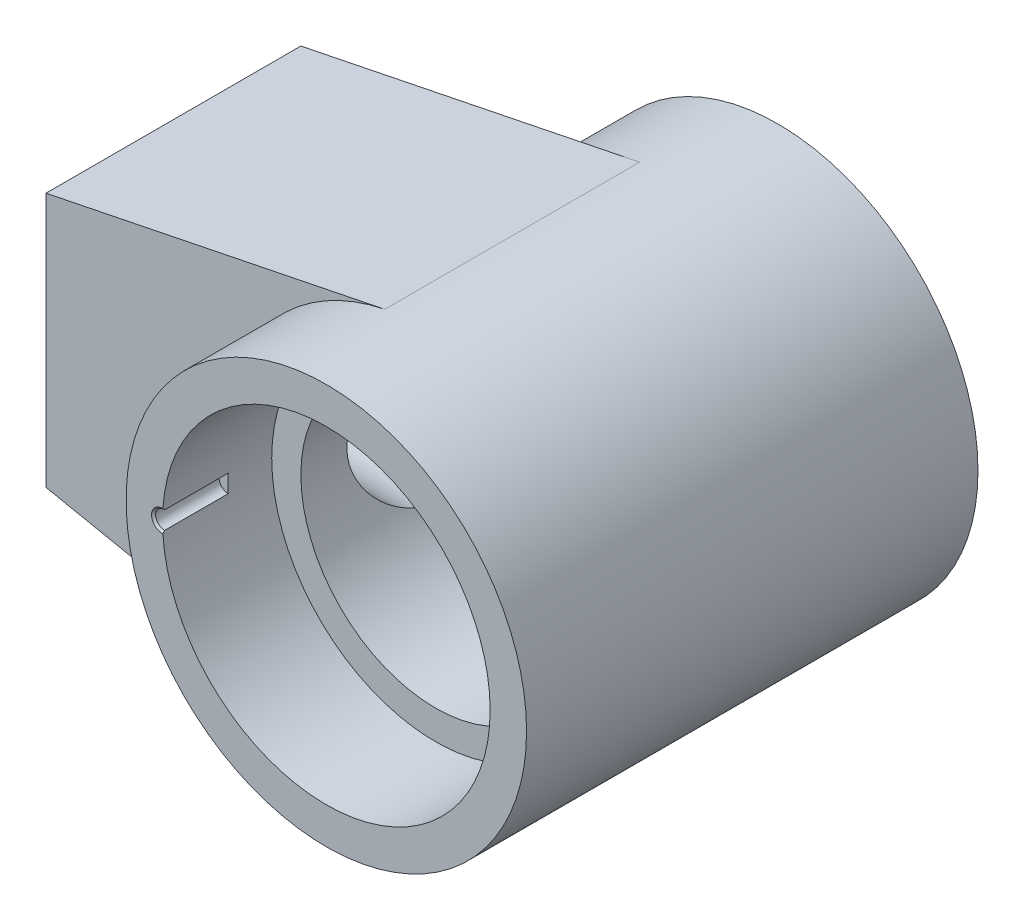
ISO-10303-21;
HEADER;
FILE_DESCRIPTION(('STEP AP214'),'2;1');
FILE_NAME('part.step','',(''),(''),'','','');
FILE_SCHEMA(('AUTOMOTIVE_DESIGN { 1 0 10303 214 1 1 1 1 }'));
ENDSEC;
DATA;
#1=APPLICATION_CONTEXT('core data for automotive mechanical design processes');
#2=APPLICATION_PROTOCOL_DEFINITION('international standard','automotive_design',2000,#1);
#3=PRODUCT_CONTEXT('',#1,'mechanical');
#4=PRODUCT('Part','Part','',(#3));
#5=PRODUCT_RELATED_PRODUCT_CATEGORY('part','',(#4));
#6=PRODUCT_DEFINITION_FORMATION('','',#4);
#7=PRODUCT_DEFINITION_CONTEXT('part definition',#1,'design');
#8=PRODUCT_DEFINITION('design','',#6,#7);
#9=PRODUCT_DEFINITION_SHAPE('','',#8);
#10=(LENGTH_UNIT() NAMED_UNIT(*) SI_UNIT(.MILLI.,.METRE.));
#11=(NAMED_UNIT(*) PLANE_ANGLE_UNIT() SI_UNIT($,.RADIAN.));
#12=(NAMED_UNIT(*) SI_UNIT($,.STERADIAN.) SOLID_ANGLE_UNIT());
#13=UNCERTAINTY_MEASURE_WITH_UNIT(LENGTH_MEASURE(1.E-05),#10,'distance_accuracy_value','');
#14=(GEOMETRIC_REPRESENTATION_CONTEXT(3) GLOBAL_UNCERTAINTY_ASSIGNED_CONTEXT((#13)) GLOBAL_UNIT_ASSIGNED_CONTEXT((#10,
#11,#12)) REPRESENTATION_CONTEXT('',''));
#15=CARTESIAN_POINT('',(0.,0.,0.));
#16=DIRECTION('',(0.,0.,1.));
#17=DIRECTION('',(1.,0.,0.));
#18=AXIS2_PLACEMENT_3D('',#15,#16,#17);
#19=CARTESIAN_POINT('',(0.,0.,62.));
#20=DIRECTION('',(0.,0.,1.));
#21=DIRECTION('',(1.,0.,0.));
#22=AXIS2_PLACEMENT_3D('',#19,#20,#21);
#23=PLANE('',#22);
#24=CARTESIAN_POINT('',(0.,0.,62.));
#25=DIRECTION('',(0.,0.,1.));
#26=DIRECTION('',(1.,0.,0.));
#27=AXIS2_PLACEMENT_3D('',#24,#25,#26);
#28=CIRCLE('',#27,55.);
#29=CARTESIAN_POINT('',(55.,0.,62.));
#30=VERTEX_POINT('',#29);
#31=EDGE_CURVE('E304',#30,#30,#28,.T.);
#32=ORIENTED_EDGE('',*,*,#31,.T.);
#33=EDGE_LOOP('',(#32));
#34=FACE_BOUND('',#33,.T.);
#35=CARTESIAN_POINT('',(0.,0.,62.));
#36=DIRECTION('',(0.,0.,1.));
#37=DIRECTION('',(1.,0.,0.));
#38=AXIS2_PLACEMENT_3D('',#35,#36,#37);
#39=CIRCLE('',#38,45.);
#40=CARTESIAN_POINT('',(-44.9,-2.99833287011296,62.));
#41=VERTEX_POINT('',#40);
#42=CARTESIAN_POINT('',(-44.9,2.99833287011296,62.));
#43=VERTEX_POINT('',#42);
#44=EDGE_CURVE('E275',#41,#43,#39,.T.);
#45=ORIENTED_EDGE('',*,*,#44,.F.);
#46=CARTESIAN_POINT('',(-45.,0.,62.));
#47=DIRECTION('',(0.,0.,1.));
#48=DIRECTION('',(1.,0.,0.));
#49=AXIS2_PLACEMENT_3D('',#46,#47,#48);
#50=CIRCLE('',#49,2.99999999999998);
#51=EDGE_CURVE('E132',#41,#43,#50,.F.);
#52=ORIENTED_EDGE('',*,*,#51,.T.);
#53=EDGE_LOOP('',(#45,#52));
#54=FACE_BOUND('',#53,.T.);
#55=ADVANCED_FACE('F36',(#34,#54),#23,.T.);
#56=CARTESIAN_POINT('',(0.,0.,32.));
#57=DIRECTION('',(0.,0.,1.));
#58=DIRECTION('',(1.,0.,0.));
#59=AXIS2_PLACEMENT_3D('',#56,#57,#58);
#60=CYLINDRICAL_SURFACE('',#59,45.);
#61=CARTESIAN_POINT('',(0.,0.,32.));
#62=DIRECTION('',(0.,0.,1.));
#63=DIRECTION('',(1.,0.,0.));
#64=AXIS2_PLACEMENT_3D('',#61,#62,#63);
#65=CIRCLE('',#64,45.);
#66=CARTESIAN_POINT('',(45.,0.,32.));
#67=VERTEX_POINT('',#66);
#68=EDGE_CURVE('E271',#67,#67,#65,.T.);
#69=ORIENTED_EDGE('',*,*,#68,.F.);
#70=EDGE_LOOP('',(#69));
#71=FACE_BOUND('',#70,.T.);
#72=ORIENTED_EDGE('',*,*,#44,.T.);
#73=CARTESIAN_POINT('',(-44.9,2.99833287011296,62.));
#74=CARTESIAN_POINT('',(-44.9061608501905,2.90607372986825,61.9075876456696));
#75=CARTESIAN_POINT('',(-44.9120371361656,2.81379950729287,61.8151731351687));
#76=CARTESIAN_POINT('',(-44.923220579684,2.62922089749069,61.6303398018353));
#77=CARTESIAN_POINT('',(-44.9285277372275,2.5369165102639,61.537920979003));
#78=CARTESIAN_POINT('',(-44.9335503305556,2.44459704070645,61.4455));
#79=B_SPLINE_CURVE_WITH_KNOTS('',3,(#73,#74,#75,#76,#77,#78),.UNSPECIFIED.,.F.,.F.,(4,2,4),(0.,
0.39218049640312,0.784360992764142),.UNSPECIFIED.);
#80=CARTESIAN_POINT('',(-44.9335503305555,2.44459704070645,61.4455));
#81=VERTEX_POINT('',#80);
#82=EDGE_CURVE('E130',#43,#81,#79,.T.);
#83=ORIENTED_EDGE('',*,*,#82,.T.);
#84=DIRECTION('',(0.,0.,1.));
#85=VECTOR('',#84,1.);
#86=CARTESIAN_POINT('',(-44.9335503305555,2.44459704070645,53.));
#87=LINE('',#86,#85);
#88=CARTESIAN_POINT('',(-44.9335503305556,2.44459704070645,44.));
#89=VERTEX_POINT('',#88);
#90=EDGE_CURVE('E118',#89,#81,#87,.T.);
#91=ORIENTED_EDGE('',*,*,#90,.F.);
#92=CARTESIAN_POINT('',(0.,0.,44.));
#93=DIRECTION('',(0.,0.,1.));
#94=DIRECTION('',(1.,0.,0.));
#95=AXIS2_PLACEMENT_3D('',#92,#93,#94);
#96=CIRCLE('',#95,45.);
#97=CARTESIAN_POINT('',(-44.9335503305556,-2.44459704070645,44.));
#98=VERTEX_POINT('',#97);
#99=EDGE_CURVE('E111',#98,#89,#96,.F.);
#100=ORIENTED_EDGE('',*,*,#99,.F.);
#101=DIRECTION('',(0.,0.,1.));
#102=VECTOR('',#101,1.);
#103=CARTESIAN_POINT('',(-44.9335503305555,-2.44459704070645,53.));
#104=LINE('',#103,#102);
#105=CARTESIAN_POINT('',(-44.9335503305555,-2.44459704070645,61.4455));
#106=VERTEX_POINT('',#105);
#107=EDGE_CURVE('E125',#106,#98,#104,.F.);
#108=ORIENTED_EDGE('',*,*,#107,.F.);
#109=CARTESIAN_POINT('',(-44.9335503305555,-2.44459704070645,61.4455));
#110=CARTESIAN_POINT('',(-44.9285277372275,-2.5369165102639,61.537920979003));
#111=CARTESIAN_POINT('',(-44.923220579684,-2.62922089749069,61.6303398018353));
#112=CARTESIAN_POINT('',(-44.9120371361656,-2.81379950729287,61.8151731351687));
#113=CARTESIAN_POINT('',(-44.9061608501905,-2.90607372986825,61.9075876456696));
#114=CARTESIAN_POINT('',(-44.9,-2.99833287011297,62.));
#115=B_SPLINE_CURVE_WITH_KNOTS('',3,(#109,#110,#111,#112,#113,#114),.UNSPECIFIED.,.F.,.F.,(4,2,
4),(0.,0.392180496361022,0.784360992764143),.UNSPECIFIED.);
#116=EDGE_CURVE('E138',#106,#41,#115,.T.);
#117=ORIENTED_EDGE('',*,*,#116,.T.);
#118=EDGE_LOOP('',(#72,#83,#91,#100,#108,#117));
#119=FACE_BOUND('',#118,.T.);
#120=ADVANCED_FACE('F129',(#71,#119),#60,.F.);
#121=CARTESIAN_POINT('',(0.,0.,-62.));
#122=DIRECTION('',(0.,0.,1.));
#123=DIRECTION('',(1.,0.,0.));
#124=AXIS2_PLACEMENT_3D('',#121,#122,#123);
#125=CYLINDRICAL_SURFACE('',#124,37.);
#126=CARTESIAN_POINT('',(-37.,0.,19.352));
#127=CARTESIAN_POINT('',(-37.0000005981691,-0.506052389142178,19.3520007767979));
#128=CARTESIAN_POINT('',(-36.9895954964608,-1.01209703583665,19.3321292544199));
#129=CARTESIAN_POINT('',(-36.9482420706369,-2.02042269786199,19.2528864913063));
#130=CARTESIAN_POINT('',(-36.9172860887485,-2.52270223963875,19.1935005264803));
#131=CARTESIAN_POINT('',(-36.8355649389102,-3.52022469257321,19.0358422705501));
#132=CARTESIAN_POINT('',(-36.7847708466761,-4.01545622989124,18.9375131968104));
#133=CARTESIAN_POINT('',(-36.6646659427644,-4.9945512790452,18.7031480711273));
#134=CARTESIAN_POINT('',(-36.5953566725505,-5.47841573359016,18.5671151581462));
#135=CARTESIAN_POINT('',(-36.440224593301,-6.42972739055406,18.2594479074291));
#136=CARTESIAN_POINT('',(-36.3544695553745,-6.8972329664037,18.0879594588808));
#137=CARTESIAN_POINT('',(-36.1682555541144,-7.81515442298426,17.7107175181484));
#138=CARTESIAN_POINT('',(-36.0677963363498,-8.26557000783181,17.5049634330466));
#139=CARTESIAN_POINT('',(-35.8544229269288,-9.14690759609061,17.0609914892987));
#140=CARTESIAN_POINT('',(-35.7415107218637,-9.57783269334452,16.8227788072608));
#141=CARTESIAN_POINT('',(-35.5056204451637,-10.4183244494518,16.3156175861637));
#142=CARTESIAN_POINT('',(-35.3826415025798,-10.8278892552367,16.0466663868853));
#143=CARTESIAN_POINT('',(-35.1210067498783,-11.6495728856682,15.461496055963));
#144=CARTESIAN_POINT('',(-34.9818513800329,-12.0601599431576,15.1433489030841));
#145=CARTESIAN_POINT('',(-34.6982309384198,-12.853413226828,14.4761292811505));
#146=CARTESIAN_POINT('',(-34.5537656774987,-13.2360784569017,14.1270557097829));
#147=CARTESIAN_POINT('',(-34.2627491701499,-13.9721424390472,13.3995193011221));
#148=CARTESIAN_POINT('',(-34.1161963924723,-14.325518257621,13.0210338754211));
#149=CARTESIAN_POINT('',(-33.8245859300124,-15.0010924809659,12.2366286963572));
#150=CARTESIAN_POINT('',(-33.679528319043,-15.3232893530283,11.8307075959632));
#151=CARTESIAN_POINT('',(-33.3821014874946,-15.9615099909244,10.9566349452515));
#152=CARTESIAN_POINT('',(-33.2301954305391,-16.2745533634966,10.4861423888152));
#153=CARTESIAN_POINT('',(-32.9372410994983,-16.8595731989986,9.51708917371545));
#154=CARTESIAN_POINT('',(-32.7961920865564,-17.131552457686,9.01853042905083));
#155=CARTESIAN_POINT('',(-32.5299271173334,-17.6319075215883,7.99621219001476));
#156=CARTESIAN_POINT('',(-32.4047032093171,-17.8603052551288,7.47246553608207));
#157=CARTESIAN_POINT('',(-32.1748937237233,-18.2710614497447,6.40283467926718));
#158=CARTESIAN_POINT('',(-32.070305650227,-18.4534254793753,5.85695316325201));
#159=CARTESIAN_POINT('',(-31.8919827061672,-18.7598220436959,4.7814252518492));
#160=CARTESIAN_POINT('',(-31.8167412212346,-18.8867616418427,4.25285847438943));
#161=CARTESIAN_POINT('',(-31.6915810918886,-19.0960370571894,3.18398352995439));
#162=CARTESIAN_POINT('',(-31.6416612640038,-19.1783749589742,2.64367591294793));
#163=CARTESIAN_POINT('',(-31.5694436736182,-19.2970225373591,1.55672928224647));
#164=CARTESIAN_POINT('',(-31.5471182663029,-19.3333782809433,1.01009715983012));
#165=CARTESIAN_POINT('',(-31.5310617463493,-19.3595565594709,-0.0846732269199204));
#166=CARTESIAN_POINT('',(-31.5373274167103,-19.3493843296321,-0.632811314870108));
#167=CARTESIAN_POINT('',(-31.5753870002611,-19.2871961525082,-1.65183489643683));
#168=CARTESIAN_POINT('',(-31.6036443295844,-19.2409753102658,-2.12322143275913));
#169=CARTESIAN_POINT('',(-31.6803413348338,-19.1144305464454,-3.05967906561738));
#170=CARTESIAN_POINT('',(-31.728778874972,-19.0341102337937,-3.52475082510554));
#171=CARTESIAN_POINT('',(-31.8442374179493,-18.8403085656461,-4.44569562723011));
#172=CARTESIAN_POINT('',(-31.9112640219202,-18.7268172147198,-4.9015658528383));
#173=CARTESIAN_POINT('',(-32.0617991540604,-18.4679026779113,-5.80135095111683));
#174=CARTESIAN_POINT('',(-32.1453086291952,-18.3224776573382,-6.24526513522869));
#175=CARTESIAN_POINT('',(-32.3284407218987,-17.9974295654423,-7.12874197277612));
#176=CARTESIAN_POINT('',(-32.4283840409931,-17.8171096913214,-7.56798113288297));
#177=CARTESIAN_POINT('',(-32.6402718684333,-17.4259040580488,-8.4298186509097));
#178=CARTESIAN_POINT('',(-32.7522213163215,-17.2150057056921,-8.85241006111709));
#179=CARTESIAN_POINT('',(-32.9852876082079,-16.7641043545781,-9.67917636643004));
#180=CARTESIAN_POINT('',(-33.106405531151,-16.5240979283788,-10.0833490850325));
#181=CARTESIAN_POINT('',(-33.3550116728951,-16.0163388116769,-10.8718314861868));
#182=CARTESIAN_POINT('',(-33.4825004458614,-15.7485837052851,-11.2561394348751));
#183=CARTESIAN_POINT('',(-33.7593067870855,-15.1470671266721,-12.0561468439793));
#184=CARTESIAN_POINT('',(-33.9091736677915,-14.8093179555884,-12.4686651527801));
#185=CARTESIAN_POINT('',(-34.2097412192137,-14.1011202046737,-13.2643133259577));
#186=CARTESIAN_POINT('',(-34.3604419556169,-13.7306690133557,-13.6474408386977));
#187=CARTESIAN_POINT('',(-34.659003455252,-12.9585826659496,-14.3826048420035));
#188=CARTESIAN_POINT('',(-34.80686253717,-12.5569297168324,-14.7346233442141));
#189=CARTESIAN_POINT('',(-35.0960263974538,-11.7244647776846,-15.405275418106));
#190=CARTESIAN_POINT('',(-35.2373314477179,-11.2936539991125,-15.7239103754172));
#191=CARTESIAN_POINT('',(-35.5174897446434,-10.3801997012022,-16.3423423145476));
#192=CARTESIAN_POINT('',(-35.6557728414984,-9.89600673272484,-16.6401158411191));
#193=CARTESIAN_POINT('',(-35.917311260513,-8.90010010147755,-17.1933880252406));
#194=CARTESIAN_POINT('',(-36.0405657689675,-8.38838495071148,-17.4488843940111));
#195=CARTESIAN_POINT('',(-36.2683629257818,-7.34116784706474,-17.9146672515024));
#196=CARTESIAN_POINT('',(-36.3729184458063,-6.80568257601899,-18.124984859758));
#197=CARTESIAN_POINT('',(-36.5602063333196,-5.71467324933082,-18.4979629467246));
#198=CARTESIAN_POINT('',(-36.6429414786077,-5.15915175460505,-18.6606294918511));
#199=CARTESIAN_POINT('',(-36.7777517321049,-4.08229149323092,-18.9239141749623));
#200=CARTESIAN_POINT('',(-36.8318806636757,-3.56223259032856,-19.028725495518));
#201=CARTESIAN_POINT('',(-36.9182766530851,-2.51348101085802,-19.1954202796859));
#202=CARTESIAN_POINT('',(-36.9505449626162,-1.98478883038832,-19.2573062011193));
#203=CARTESIAN_POINT('',(-36.9922853940242,-0.923447573826113,-19.3372760233808));
#204=CARTESIAN_POINT('',(-37.0017679265282,-0.390800416355899,-19.3553799278633));
#205=CARTESIAN_POINT('',(-36.9976898987752,0.674069841192297,-19.3475834527039));
#206=CARTESIAN_POINT('',(-36.984130556373,1.20629296219482,-19.3216853987406));
#207=CARTESIAN_POINT('',(-36.9365301316964,2.2197850358863,-19.2304055188542));
#208=CARTESIAN_POINT('',(-36.9043653413018,2.70147358304109,-19.1686389143131));
#209=CARTESIAN_POINT('',(-36.8219251070411,3.65730748968205,-19.0094375075377));
#210=CARTESIAN_POINT('',(-36.7716509640792,4.13145338844824,-18.9120052673735));
#211=CARTESIAN_POINT('',(-36.6541544995467,5.06914942263336,-18.6825225783252));
#212=CARTESIAN_POINT('',(-36.5869312926692,5.53269900319093,-18.5504703211063));
#213=CARTESIAN_POINT('',(-36.4370423793131,6.4464190426839,-18.253066830169));
#214=CARTESIAN_POINT('',(-36.3543760091159,6.89658892562041,-18.0877141652368));
#215=CARTESIAN_POINT('',(-36.1730352117827,7.79268476694923,-17.7204554527878));
#216=CARTESIAN_POINT('',(-36.0739984072793,8.23819120654106,-17.5177058997264));
#217=CARTESIAN_POINT('',(-35.8636869060655,9.1102793819269,-17.0804180991494));
#218=CARTESIAN_POINT('',(-35.7524121301092,9.53686099514975,-16.8458796457853));
#219=CARTESIAN_POINT('',(-35.5199137876705,10.3693078564812,-16.3466505031095));
#220=CARTESIAN_POINT('',(-35.398687395072,10.7751671663087,-16.081951240223));
#221=CARTESIAN_POINT('',(-35.1487632701505,11.5644211165479,-15.5240989932343));
#222=CARTESIAN_POINT('',(-35.0200649125689,11.9478138715348,-15.2309436265247));
#223=CARTESIAN_POINT('',(-34.7439942563599,12.7296606551594,-14.585568835572));
#224=CARTESIAN_POINT('',(-34.5960792549236,13.1254757882933,-14.2303794749891));
#225=CARTESIAN_POINT('',(-34.2978526144724,13.8861171225775,-13.4891707455103));
#226=CARTESIAN_POINT('',(-34.1475408224038,14.2509413352277,-13.1031494013908));
#227=CARTESIAN_POINT('',(-33.8481184643427,14.9482079366972,-12.3017575627707));
#228=CARTESIAN_POINT('',(-33.6990089827763,15.2806235646793,-11.8863632942375));
#229=CARTESIAN_POINT('',(-33.4793218872077,15.7532607399888,-11.2430206281004));
#230=CARTESIAN_POINT('',(-33.406753318712,15.9064801711803,-11.0251901394122));
#231=CARTESIAN_POINT('',(-33.2634066232808,16.2041064523991,-10.5829065536732));
#232=CARTESIAN_POINT('',(-33.1926290942553,16.3485103816549,-10.3584512978386));
#233=CARTESIAN_POINT('',(-32.9752508244734,16.7851943253054,-9.64772459253451));
#234=CARTESIAN_POINT('',(-32.8326898383814,17.0615765575446,-9.15029550971333));
#235=CARTESIAN_POINT('',(-32.5630013305178,17.5708298932735,-8.12963618723386));
#236=CARTESIAN_POINT('',(-32.4358720382279,17.8037059899915,-7.60640891717358));
#237=CARTESIAN_POINT('',(-32.260509095359,18.1183312996264,-6.80501993029528));
#238=CARTESIAN_POINT('',(-32.2046255451745,18.2173984917431,-6.53522218657912));
#239=CARTESIAN_POINT('',(-32.0985284318642,18.4036936358615,-5.99056031879956));
#240=CARTESIAN_POINT('',(-32.0483134167665,18.4909246208208,-5.71569751321001));
#241=CARTESIAN_POINT('',(-31.9070160492189,18.7344011095114,-4.88419822459491));
#242=CARTESIAN_POINT('',(-31.8252418369042,18.8725001436232,-4.32047302530095));
#243=CARTESIAN_POINT('',(-31.6971168666236,19.0868217547136,-3.23549776274078));
#244=CARTESIAN_POINT('',(-31.6480834377358,19.1677756975774,-2.71548701861714));
#245=CARTESIAN_POINT('',(-31.5755072700609,19.2871014711559,-1.66880744655593));
#246=CARTESIAN_POINT('',(-31.5519627220079,19.325476324248,-1.14213909387759));
#247=CARTESIAN_POINT('',(-31.5314076629037,19.3589957657291,-0.0871839512284485));
#248=CARTESIAN_POINT('',(-31.534383790771,19.354162122498,0.44110188976167));
#249=CARTESIAN_POINT('',(-31.5667068975352,19.3013983330508,1.49468267284914));
#250=CARTESIAN_POINT('',(-31.5960523695072,19.2534706495234,2.01997778413105));
#251=CARTESIAN_POINT('',(-31.6750731646601,19.1231470657912,3.00380044512967));
#252=CARTESIAN_POINT('',(-31.7220703132057,19.0452684611862,3.46315328640321));
#253=CARTESIAN_POINT('',(-31.8342334669313,18.8571885807057,4.37287671559751));
#254=CARTESIAN_POINT('',(-31.899397757537,18.7469903550327,4.82324814686769));
#255=CARTESIAN_POINT('',(-32.0459245414392,18.4954015672806,5.71258878904172));
#256=CARTESIAN_POINT('',(-32.1272912655395,18.3540028570393,6.15155498787794));
#257=CARTESIAN_POINT('',(-32.3039158117941,18.041320394145,7.01583129211518));
#258=CARTESIAN_POINT('',(-32.3991746048758,17.8700345524932,7.44114044047729));
#259=CARTESIAN_POINT('',(-32.6077299321633,17.4867547698549,8.30363521170009));
#260=CARTESIAN_POINT('',(-32.7217990905151,17.2728298458648,8.73977535231031));
#261=CARTESIAN_POINT('',(-32.9598973638925,16.81404080648,9.59284216950277));
#262=CARTESIAN_POINT('',(-33.0839307490239,16.5691634005424,10.0097604869367));
#263=CARTESIAN_POINT('',(-33.3389064434658,16.0499521501269,10.8227361641136));
#264=CARTESIAN_POINT('',(-33.469850299147,15.7756116983036,11.2187888147414));
#265=CARTESIAN_POINT('',(-33.7356590189858,15.1988861554762,11.9885397413551));
#266=CARTESIAN_POINT('',(-33.8705241594467,14.896499084935,12.3622364363854));
#267=CARTESIAN_POINT('',(-34.1599169908618,14.221558765677,13.1356590096056));
#268=CARTESIAN_POINT('',(-34.3145999667534,13.8450735724197,13.5319052090578));
#269=CARTESIAN_POINT('',(-34.6212562198267,13.0593448718685,14.2916798255785));
#270=CARTESIAN_POINT('',(-34.7732292482839,12.6500983764059,14.6552052517362));
#271=CARTESIAN_POINT('',(-35.0706475138065,11.8005228607647,15.3475735729091));
#272=CARTESIAN_POINT('',(-35.2160884552942,11.3601738629816,15.6763938318249));
#273=CARTESIAN_POINT('',(-35.4965755212362,10.4508131239708,16.2967271083901));
#274=CARTESIAN_POINT('',(-35.6316221240308,9.98180270350597,16.5882418432234));
#275=CARTESIAN_POINT('',(-35.8901308113983,9.00869333750198,17.1365380549132));
#276=CARTESIAN_POINT('',(-36.0133325198498,8.50410594122311,17.3925776270413));
#277=CARTESIAN_POINT('',(-36.2417613040972,7.47091883123979,17.8607654699294));
#278=CARTESIAN_POINT('',(-36.3469858824916,6.94231579414935,18.0729076432805));
#279=CARTESIAN_POINT('',(-36.5360623635611,5.86632504968395,18.4502129480697));
#280=CARTESIAN_POINT('',(-36.6199650397401,5.31898555731215,18.6154877948689));
#281=CARTESIAN_POINT('',(-36.7640580734905,4.2091387063873,18.8973695241368));
#282=CARTESIAN_POINT('',(-36.8242620069507,3.64664022961645,19.0140042724997));
#283=CARTESIAN_POINT('',(-36.9140578865085,2.57137901876232,19.1872982946929));
#284=CARTESIAN_POINT('',(-36.9462107262062,2.05963536059365,19.2489895990092));
#285=CARTESIAN_POINT('',(-36.9891817015716,1.03192517761904,19.3313404856177));
#286=CARTESIAN_POINT('',(-36.9999993901215,0.515958564540758,19.351999207996));
#287=CARTESIAN_POINT('',(-37.,0.,19.352));
#288=B_SPLINE_CURVE_WITH_KNOTS('',3,(#126,#127,#128,#129,#130,#131,#132,#133,#134,#135,#136,
#137,#138,#139,#140,#141,#142,#143,#144,#145,#146,#147,#148,#149,#150,#151,#152,#153,#154,#155,
#156,#157,#158,#159,#160,#161,#162,#163,#164,#165,#166,#167,#168,#169,#170,#171,#172,#173,#174,
#175,#176,#177,#178,#179,#180,#181,#182,#183,#184,#185,#186,#187,#188,#189,#190,#191,#192,#193,
#194,#195,#196,#197,#198,#199,#200,#201,#202,#203,#204,#205,#206,#207,#208,#209,#210,#211,#212,
#213,#214,#215,#216,#217,#218,#219,#220,#221,#222,#223,#224,#225,#226,#227,#228,#229,#230,#231,
#232,#233,#234,#235,#236,#237,#238,#239,#240,#241,#242,#243,#244,#245,#246,#247,#248,#249,#250,
#251,#252,#253,#254,#255,#256,#257,#258,#259,#260,#261,#262,#263,#264,#265,#266,#267,#268,#269,
#270,#271,#272,#273,#274,#275,#276,#277,#278,#279,#280,#281,#282,#283,#284,#285,#286,#287),
.UNSPECIFIED.,.T.,.F.,(4,2,2,2,2,2,2,2,2,2,2,2,2,2,2,2,2,2,2,2,2,2,2,2,2,2,2,2,2,2,2,2,2,2,2,2,
2,2,2,2,2,2,2,2,2,2,2,2,2,2,2,2,2,2,2,2,2,2,2,2,2,2,2,2,2,2,2,2,2,2,2,2,2,2,2,2,2,2,2,2,4),(0.,
1.51765057658801,3.03586698547042,4.55630529197482,6.07661705524856,7.59079342198909,
9.10499599210131,10.6189573540407,12.1330498388746,13.7445784661489,15.3561645564023,
16.9690008207652,18.5819163294347,20.3352753018366,22.0885148468636,23.8408698984163,
25.5930128712905,27.2369385512288,28.8807873910761,30.5229880416858,32.1650039203017,
33.5867909415078,35.0084275250164,36.4304929327743,37.8526400641089,39.3068352997644,
40.7616311300762,42.2165984275301,43.6716925056941,45.331328403169,46.9910969543783,
48.6518190484942,50.312472184728,52.0651834544694,53.8179895805842,55.5695844589579,
57.3209562462944,58.9185940540217,60.5161403766929,62.1129566551776,63.7096885381941,
65.1680816077877,66.6263699330773,68.0847344454755,69.5431616501118,71.0397636536801,
72.5363753489344,74.0334135405364,75.530577186286,77.1847925060837,78.8391138868381,
80.4947899267345,81.3226840434418,82.1508509875671,83.9083479373865,85.6656430540208,
86.5437228079764,87.4215771325891,89.1767027371958,90.7601396233252,92.3434641056842,
93.9259909563618,95.5084273763561,96.9116853229361,98.3148108779753,99.7183033008643,
101.121893861963,102.617378251347,104.113506975213,105.609971922405,107.106542570948,
108.80876463641,110.511142139372,112.214623227195,113.918025875065,115.652925324961,
117.38806559325,119.119034442384,120.849010253252,122.396337012554,123.943696198622),.UNSPECIFIED.);
#289=CARTESIAN_POINT('',(-37.,0.,19.352));
#290=VERTEX_POINT('',#289);
#291=EDGE_CURVE('E236',#290,#290,#288,.T.);
#292=ORIENTED_EDGE('',*,*,#291,.F.);
#293=EDGE_LOOP('',(#292));
#294=FACE_BOUND('',#293,.T.);
#295=CARTESIAN_POINT('',(0.,0.,32.));
#296=DIRECTION('',(0.,0.,1.));
#297=DIRECTION('',(1.,0.,0.));
#298=AXIS2_PLACEMENT_3D('',#295,#296,#297);
#299=CIRCLE('',#298,37.);
#300=CARTESIAN_POINT('',(37.,0.,32.));
#301=VERTEX_POINT('',#300);
#302=EDGE_CURVE('E274',#301,#301,#299,.F.);
#303=ORIENTED_EDGE('',*,*,#302,.F.);
#304=EDGE_LOOP('',(#303));
#305=FACE_BOUND('',#304,.T.);
#306=CARTESIAN_POINT('',(0.,0.,-32.));
#307=DIRECTION('',(0.,0.,-1.));
#308=DIRECTION('',(-1.,0.,0.));
#309=AXIS2_PLACEMENT_3D('',#306,#307,#308);
#310=CIRCLE('',#309,37.);
#311=CARTESIAN_POINT('',(-37.,0.,-32.));
#312=VERTEX_POINT('',#311);
#313=EDGE_CURVE('E222',#312,#312,#310,.F.);
#314=ORIENTED_EDGE('',*,*,#313,.F.);
#315=EDGE_LOOP('',(#314));
#316=FACE_BOUND('',#315,.T.);
#317=ADVANCED_FACE('F155',(#294,#305,#316),#125,.F.);
#318=CARTESIAN_POINT('',(0.,0.,-62.));
#319=DIRECTION('',(0.,0.,1.));
#320=DIRECTION('',(1.,0.,0.));
#321=AXIS2_PLACEMENT_3D('',#318,#319,#320);
#322=PLANE('',#321);
#323=CARTESIAN_POINT('',(0.,0.,-62.));
#324=DIRECTION('',(0.,0.,1.));
#325=DIRECTION('',(1.,0.,0.));
#326=AXIS2_PLACEMENT_3D('',#323,#324,#325);
#327=CIRCLE('',#326,55.);
#328=CARTESIAN_POINT('',(55.,0.,-62.));
#329=VERTEX_POINT('',#328);
#330=EDGE_CURVE('E303',#329,#329,#327,.T.);
#331=ORIENTED_EDGE('',*,*,#330,.F.);
#332=EDGE_LOOP('',(#331));
#333=FACE_BOUND('',#332,.T.);
#334=CARTESIAN_POINT('',(0.,0.,-62.));
#335=DIRECTION('',(0.,0.,1.));
#336=DIRECTION('',(1.,0.,0.));
#337=AXIS2_PLACEMENT_3D('',#334,#335,#336);
#338=CIRCLE('',#337,45.);
#339=CARTESIAN_POINT('',(-44.9,-2.99833287011296,-62.));
#340=VERTEX_POINT('',#339);
#341=CARTESIAN_POINT('',(-44.9,2.99833287011291,-62.));
#342=VERTEX_POINT('',#341);
#343=EDGE_CURVE('E266',#340,#342,#338,.T.);
#344=ORIENTED_EDGE('',*,*,#343,.T.);
#345=CARTESIAN_POINT('',(-45.,0.,-62.));
#346=DIRECTION('',(0.,0.,1.));
#347=DIRECTION('',(1.,0.,0.));
#348=AXIS2_PLACEMENT_3D('',#345,#346,#347);
#349=CIRCLE('',#348,2.99999999999998);
#350=EDGE_CURVE('E11',#342,#340,#349,.T.);
#351=ORIENTED_EDGE('',*,*,#350,.T.);
#352=EDGE_LOOP('',(#344,#351));
#353=FACE_BOUND('',#352,.T.);
#354=ADVANCED_FACE('F162',(#333,#353),#322,.F.);
#355=CARTESIAN_POINT('',(0.,0.,62.));
#356=DIRECTION('',(0.,0.,-1.));
#357=DIRECTION('',(-1.,0.,0.));
#358=AXIS2_PLACEMENT_3D('',#355,#356,#357);
#359=CYLINDRICAL_SURFACE('',#358,55.);
#360=CARTESIAN_POINT('',(0.,0.,35.));
#361=DIRECTION('',(0.,0.,1.));
#362=DIRECTION('',(1.,0.,0.));
#363=AXIS2_PLACEMENT_3D('',#360,#361,#362);
#364=CIRCLE('',#363,55.);
#365=CARTESIAN_POINT('',(-10.9472807038264,53.8995087657729,35.));
#366=VERTEX_POINT('',#365);
#367=CARTESIAN_POINT('',(-10.9472807038264,-53.8995087657729,35.));
#368=VERTEX_POINT('',#367);
#369=EDGE_CURVE('E215',#366,#368,#364,.T.);
#370=ORIENTED_EDGE('',*,*,#369,.T.);
#371=DIRECTION('',(0.,0.,-1.));
#372=VECTOR('',#371,1.);
#373=CARTESIAN_POINT('',(-10.9472807038264,-53.8995087657729,35.));
#374=LINE('',#373,#372);
#375=CARTESIAN_POINT('',(-10.9472807038264,-53.8995087657729,-35.));
#376=VERTEX_POINT('',#375);
#377=EDGE_CURVE('E280',#368,#376,#374,.T.);
#378=ORIENTED_EDGE('',*,*,#377,.T.);
#379=CARTESIAN_POINT('',(0.,0.,-35.));
#380=DIRECTION('',(0.,0.,1.));
#381=DIRECTION('',(1.,0.,0.));
#382=AXIS2_PLACEMENT_3D('',#379,#380,#381);
#383=CIRCLE('',#382,55.);
#384=CARTESIAN_POINT('',(-10.9472807038264,53.8995087657729,-35.));
#385=VERTEX_POINT('',#384);
#386=EDGE_CURVE('E219',#385,#376,#383,.T.);
#387=ORIENTED_EDGE('',*,*,#386,.F.);
#388=DIRECTION('',(0.,0.,-1.));
#389=VECTOR('',#388,1.);
#390=CARTESIAN_POINT('',(-10.9472807038264,53.8995087657729,35.));
#391=LINE('',#390,#389);
#392=EDGE_CURVE('E300',#366,#385,#391,.T.);
#393=ORIENTED_EDGE('',*,*,#392,.F.);
#394=EDGE_LOOP('',(#370,#378,#387,#393));
#395=FACE_BOUND('',#394,.T.);
#396=ORIENTED_EDGE('',*,*,#31,.F.);
#397=EDGE_LOOP('',(#396));
#398=FACE_BOUND('',#397,.T.);
#399=ORIENTED_EDGE('',*,*,#330,.T.);
#400=EDGE_LOOP('',(#399));
#401=FACE_BOUND('',#400,.T.);
#402=ADVANCED_FACE('F173',(#395,#398,#401),#359,.T.);
#403=CARTESIAN_POINT('',(0.,0.,35.));
#404=DIRECTION('',(0.,0.,1.));
#405=DIRECTION('',(1.,0.,0.));
#406=AXIS2_PLACEMENT_3D('',#403,#404,#405);
#407=PLANE('',#406);
#408=ORIENTED_EDGE('',*,*,#369,.F.);
#409=DIRECTION('',(-0.979991068468598,-0.199041467342299,0.));
#410=VECTOR('',#409,1.);
#411=CARTESIAN_POINT('',(-104.,35.,35.));
#412=LINE('',#411,#410);
#413=CARTESIAN_POINT('',(-104.,35.,35.));
#414=VERTEX_POINT('',#413);
#415=EDGE_CURVE('E290',#366,#414,#412,.T.);
#416=ORIENTED_EDGE('',*,*,#415,.T.);
#417=DIRECTION('',(0.,-1.,0.));
#418=VECTOR('',#417,1.);
#419=CARTESIAN_POINT('',(-104.,0.,35.));
#420=LINE('',#419,#418);
#421=CARTESIAN_POINT('',(-104.,-35.,35.));
#422=VERTEX_POINT('',#421);
#423=EDGE_CURVE('E292',#414,#422,#420,.T.);
#424=ORIENTED_EDGE('',*,*,#423,.T.);
#425=DIRECTION('',(-0.979991068468598,0.199041467342298,0.));
#426=VECTOR('',#425,1.);
#427=CARTESIAN_POINT('',(-104.,-35.,35.));
#428=LINE('',#427,#426);
#429=EDGE_CURVE('E277',#368,#422,#428,.T.);
#430=ORIENTED_EDGE('',*,*,#429,.F.);
#431=EDGE_LOOP('',(#408,#416,#424,#430));
#432=FACE_BOUND('',#431,.T.);
#433=ADVANCED_FACE('F169',(#432),#407,.T.);
#434=CARTESIAN_POINT('',(0.,0.,-35.));
#435=DIRECTION('',(0.,0.,1.));
#436=DIRECTION('',(1.,0.,0.));
#437=AXIS2_PLACEMENT_3D('',#434,#435,#436);
#438=PLANE('',#437);
#439=DIRECTION('',(-0.979991068468598,-0.199041467342299,0.));
#440=VECTOR('',#439,1.);
#441=CARTESIAN_POINT('',(-104.,35.,-35.));
#442=LINE('',#441,#440);
#443=CARTESIAN_POINT('',(-104.,35.,-35.));
#444=VERTEX_POINT('',#443);
#445=EDGE_CURVE('E289',#385,#444,#442,.T.);
#446=ORIENTED_EDGE('',*,*,#445,.F.);
#447=ORIENTED_EDGE('',*,*,#386,.T.);
#448=DIRECTION('',(-0.979991068468598,0.199041467342298,0.));
#449=VECTOR('',#448,1.);
#450=CARTESIAN_POINT('',(-104.,-35.,-35.));
#451=LINE('',#450,#449);
#452=CARTESIAN_POINT('',(-104.,-35.,-35.));
#453=VERTEX_POINT('',#452);
#454=EDGE_CURVE('E281',#376,#453,#451,.T.);
#455=ORIENTED_EDGE('',*,*,#454,.T.);
#456=DIRECTION('',(0.,-1.,0.));
#457=VECTOR('',#456,1.);
#458=CARTESIAN_POINT('',(-104.,0.,-35.));
#459=LINE('',#458,#457);
#460=EDGE_CURVE('E293',#444,#453,#459,.T.);
#461=ORIENTED_EDGE('',*,*,#460,.F.);
#462=EDGE_LOOP('',(#446,#447,#455,#461));
#463=FACE_BOUND('',#462,.T.);
#464=ADVANCED_FACE('F172',(#463),#438,.F.);
#465=CARTESIAN_POINT('',(-104.,35.,35.));
#466=DIRECTION('',(0.199041467342299,-0.979991068468598,0.));
#467=DIRECTION('',(0.979991068468598,0.199041467342299,0.));
#468=AXIS2_PLACEMENT_3D('',#465,#466,#467);
#469=PLANE('',#468);
#470=ORIENTED_EDGE('',*,*,#445,.T.);
#471=DIRECTION('',(0.,0.,-1.));
#472=VECTOR('',#471,1.);
#473=CARTESIAN_POINT('',(-104.,35.,35.));
#474=LINE('',#473,#472);
#475=EDGE_CURVE('E295',#414,#444,#474,.T.);
#476=ORIENTED_EDGE('',*,*,#475,.F.);
#477=ORIENTED_EDGE('',*,*,#415,.F.);
#478=ORIENTED_EDGE('',*,*,#392,.T.);
#479=EDGE_LOOP('',(#470,#476,#477,#478));
#480=FACE_BOUND('',#479,.T.);
#481=ADVANCED_FACE('F177',(#480),#469,.F.);
#482=CARTESIAN_POINT('',(-104.,0.,35.));
#483=DIRECTION('',(1.,0.,0.));
#484=DIRECTION('',(0.,0.,-1.));
#485=AXIS2_PLACEMENT_3D('',#482,#483,#484);
#486=PLANE('',#485);
#487=CARTESIAN_POINT('',(-104.,0.,0.));
#488=DIRECTION('',(1.,0.,0.));
#489=DIRECTION('',(0.,0.,-1.));
#490=AXIS2_PLACEMENT_3D('',#487,#488,#489);
#491=CIRCLE('',#490,20.9999999999999);
#492=CARTESIAN_POINT('',(-104.,0.,-20.9999999999999));
#493=VERTEX_POINT('',#492);
#494=EDGE_CURVE('E211',#493,#493,#491,.T.);
#495=ORIENTED_EDGE('',*,*,#494,.T.);
#496=EDGE_LOOP('',(#495));
#497=FACE_BOUND('',#496,.T.);
#498=ORIENTED_EDGE('',*,*,#460,.T.);
#499=DIRECTION('',(0.,0.,-1.));
#500=VECTOR('',#499,1.);
#501=CARTESIAN_POINT('',(-104.,-35.,35.));
#502=LINE('',#501,#500);
#503=EDGE_CURVE('E286',#422,#453,#502,.T.);
#504=ORIENTED_EDGE('',*,*,#503,.F.);
#505=ORIENTED_EDGE('',*,*,#423,.F.);
#506=ORIENTED_EDGE('',*,*,#475,.T.);
#507=EDGE_LOOP('',(#498,#504,#505,#506));
#508=FACE_BOUND('',#507,.T.);
#509=ADVANCED_FACE('F167',(#497,#508),#486,.F.);
#510=CARTESIAN_POINT('',(-104.,-35.,35.));
#511=DIRECTION('',(-0.199041467342298,-0.979991068468598,0.));
#512=DIRECTION('',(0.979991068468598,-0.199041467342298,0.));
#513=AXIS2_PLACEMENT_3D('',#510,#511,#512);
#514=PLANE('',#513);
#515=ORIENTED_EDGE('',*,*,#454,.F.);
#516=ORIENTED_EDGE('',*,*,#377,.F.);
#517=ORIENTED_EDGE('',*,*,#429,.T.);
#518=ORIENTED_EDGE('',*,*,#503,.T.);
#519=EDGE_LOOP('',(#515,#516,#517,#518));
#520=FACE_BOUND('',#519,.T.);
#521=ADVANCED_FACE('F164',(#520),#514,.T.);
#522=CARTESIAN_POINT('',(0.,0.,32.));
#523=DIRECTION('',(0.,0.,1.));
#524=DIRECTION('',(1.,0.,0.));
#525=AXIS2_PLACEMENT_3D('',#522,#523,#524);
#526=PLANE('',#525);
#527=ORIENTED_EDGE('',*,*,#68,.T.);
#528=EDGE_LOOP('',(#527));
#529=FACE_BOUND('',#528,.T.);
#530=ORIENTED_EDGE('',*,*,#302,.T.);
#531=EDGE_LOOP('',(#530));
#532=FACE_BOUND('',#531,.T.);
#533=ADVANCED_FACE('F157',(#529,#532),#526,.T.);
#534=CARTESIAN_POINT('',(0.,0.,-32.));
#535=DIRECTION('',(0.,0.,-1.));
#536=DIRECTION('',(1.,0.,0.));
#537=AXIS2_PLACEMENT_3D('',#534,#535,#536);
#538=PLANE('',#537);
#539=CARTESIAN_POINT('',(0.,0.,-32.));
#540=DIRECTION('',(0.,0.,1.));
#541=DIRECTION('',(1.,0.,0.));
#542=AXIS2_PLACEMENT_3D('',#539,#540,#541);
#543=CIRCLE('',#542,45.);
#544=CARTESIAN_POINT('',(45.,0.,-32.));
#545=VERTEX_POINT('',#544);
#546=EDGE_CURVE('E267',#545,#545,#543,.T.);
#547=ORIENTED_EDGE('',*,*,#546,.F.);
#548=EDGE_LOOP('',(#547));
#549=FACE_BOUND('',#548,.T.);
#550=ORIENTED_EDGE('',*,*,#313,.T.);
#551=EDGE_LOOP('',(#550));
#552=FACE_BOUND('',#551,.T.);
#553=ADVANCED_FACE('F254',(#549,#552),#538,.T.);
#554=CARTESIAN_POINT('',(0.,0.,-32.));
#555=DIRECTION('',(0.,0.,-1.));
#556=DIRECTION('',(-1.,0.,0.));
#557=AXIS2_PLACEMENT_3D('',#554,#555,#556);
#558=CYLINDRICAL_SURFACE('',#557,45.);
#559=DIRECTION('',(0.,0.,-1.));
#560=VECTOR('',#559,1.);
#561=CARTESIAN_POINT('',(-44.9335503305555,2.44459704070645,-53.));
#562=LINE('',#561,#560);
#563=CARTESIAN_POINT('',(-44.9335503305555,2.44459704070645,-61.4455));
#564=VERTEX_POINT('',#563);
#565=CARTESIAN_POINT('',(-44.9335503305556,2.44459704070645,-44.));
#566=VERTEX_POINT('',#565);
#567=EDGE_CURVE('E119',#564,#566,#562,.F.);
#568=ORIENTED_EDGE('',*,*,#567,.F.);
#569=CARTESIAN_POINT('',(-44.9335503305555,2.44459704070645,-61.4455));
#570=CARTESIAN_POINT('',(-44.9285277372275,2.5369165102639,-61.537920979003));
#571=CARTESIAN_POINT('',(-44.923220579684,2.62922089749069,-61.6303398018353));
#572=CARTESIAN_POINT('',(-44.9120371361656,2.81379950729287,-61.8151731351687));
#573=CARTESIAN_POINT('',(-44.9061608501905,2.90607372986825,-61.9075876456696));
#574=CARTESIAN_POINT('',(-44.9,2.99833287011297,-62.));
#575=B_SPLINE_CURVE_WITH_KNOTS('',3,(#569,#570,#571,#572,#573,#574),.UNSPECIFIED.,.F.,.F.,(4,2,
4),(0.,0.392180496361036,0.784360992764153),.UNSPECIFIED.);
#576=EDGE_CURVE('E45',#564,#342,#575,.T.);
#577=ORIENTED_EDGE('',*,*,#576,.T.);
#578=ORIENTED_EDGE('',*,*,#343,.F.);
#579=CARTESIAN_POINT('',(-44.9,-2.99833287011296,-62.));
#580=CARTESIAN_POINT('',(-44.9061608501905,-2.90607372986825,-61.9075876456696));
#581=CARTESIAN_POINT('',(-44.9120371361656,-2.81379950729287,-61.8151731351687));
#582=CARTESIAN_POINT('',(-44.923220579684,-2.62922089749069,-61.6303398018353));
#583=CARTESIAN_POINT('',(-44.9285277372275,-2.5369165102639,-61.537920979003));
#584=CARTESIAN_POINT('',(-44.9335503305556,-2.44459704070645,-61.4455));
#585=B_SPLINE_CURVE_WITH_KNOTS('',3,(#579,#580,#581,#582,#583,#584),.UNSPECIFIED.,.F.,.F.,(4,2,
4),(0.,0.392180496403116,0.784360992764152),.UNSPECIFIED.);
#586=CARTESIAN_POINT('',(-44.9335503305555,-2.44459704070645,-61.4455));
#587=VERTEX_POINT('',#586);
#588=EDGE_CURVE('E240',#340,#587,#585,.T.);
#589=ORIENTED_EDGE('',*,*,#588,.T.);
#590=DIRECTION('',(0.,0.,-1.));
#591=VECTOR('',#590,1.);
#592=CARTESIAN_POINT('',(-44.9335503305555,-2.44459704070645,-53.));
#593=LINE('',#592,#591);
#594=CARTESIAN_POINT('',(-44.9335503305556,-2.44459704070645,-44.));
#595=VERTEX_POINT('',#594);
#596=EDGE_CURVE('E227',#595,#587,#593,.T.);
#597=ORIENTED_EDGE('',*,*,#596,.F.);
#598=CARTESIAN_POINT('',(0.,0.,-44.));
#599=DIRECTION('',(0.,0.,-1.));
#600=DIRECTION('',(-1.,0.,0.));
#601=AXIS2_PLACEMENT_3D('',#598,#599,#600);
#602=CIRCLE('',#601,45.);
#603=EDGE_CURVE('E217',#595,#566,#602,.T.);
#604=ORIENTED_EDGE('',*,*,#603,.T.);
#605=EDGE_LOOP('',(#568,#577,#578,#589,#597,#604));
#606=FACE_BOUND('',#605,.T.);
#607=ORIENTED_EDGE('',*,*,#546,.T.);
#608=EDGE_LOOP('',(#607));
#609=FACE_BOUND('',#608,.T.);
#610=ADVANCED_FACE('F205',(#606,#609),#558,.F.);
#611=CARTESIAN_POINT('',(55.001,0.,0.));
#612=DIRECTION('',(-1.,0.,0.));
#613=DIRECTION('',(0.,0.,1.));
#614=AXIS2_PLACEMENT_3D('',#611,#612,#613);
#615=CYLINDRICAL_SURFACE('',#614,19.352);
#616=CARTESIAN_POINT('',(-102.352,0.,0.));
#617=DIRECTION('',(1.,0.,0.));
#618=DIRECTION('',(0.,0.,-1.));
#619=AXIS2_PLACEMENT_3D('',#616,#617,#618);
#620=CIRCLE('',#619,19.352);
#621=CARTESIAN_POINT('',(-102.352,0.,-19.352));
#622=VERTEX_POINT('',#621);
#623=EDGE_CURVE('E214',#622,#622,#620,.F.);
#624=ORIENTED_EDGE('',*,*,#623,.T.);
#625=EDGE_LOOP('',(#624));
#626=FACE_BOUND('',#625,.T.);
#627=ORIENTED_EDGE('',*,*,#291,.T.);
#628=EDGE_LOOP('',(#627));
#629=FACE_BOUND('',#628,.T.);
#630=ADVANCED_FACE('F196',(#626,#629),#615,.F.);
#631=CARTESIAN_POINT('',(-102.352,0.,0.));
#632=DIRECTION('',(-1.,0.,0.));
#633=DIRECTION('',(0.,0.,1.));
#634=AXIS2_PLACEMENT_3D('',#631,#632,#633);
#635=CONICAL_SURFACE('',#634,19.352,0.785398163397442);
#636=ORIENTED_EDGE('',*,*,#494,.F.);
#637=EDGE_LOOP('',(#636));
#638=FACE_BOUND('',#637,.T.);
#639=ORIENTED_EDGE('',*,*,#623,.F.);
#640=EDGE_LOOP('',(#639));
#641=FACE_BOUND('',#640,.T.);
#642=ADVANCED_FACE('F193',(#638,#641),#635,.F.);
#643=CARTESIAN_POINT('',(-45.,0.,-44.));
#644=DIRECTION('',(0.,0.,-1.));
#645=DIRECTION('',(-1.,0.,0.));
#646=AXIS2_PLACEMENT_3D('',#643,#644,#645);
#647=CYLINDRICAL_SURFACE('',#646,2.4455);
#648=ORIENTED_EDGE('',*,*,#596,.T.);
#649=CARTESIAN_POINT('',(-45.,0.,-61.4455));
#650=DIRECTION('',(0.,0.,1.));
#651=DIRECTION('',(1.,0.,0.));
#652=AXIS2_PLACEMENT_3D('',#649,#650,#651);
#653=CIRCLE('',#652,2.4455);
#654=EDGE_CURVE('E234',#587,#564,#653,.F.);
#655=ORIENTED_EDGE('',*,*,#654,.T.);
#656=ORIENTED_EDGE('',*,*,#567,.T.);
#657=CARTESIAN_POINT('',(-45.,0.,-44.));
#658=DIRECTION('',(0.,0.,-1.));
#659=DIRECTION('',(-1.,0.,0.));
#660=AXIS2_PLACEMENT_3D('',#657,#658,#659);
#661=CIRCLE('',#660,2.4455);
#662=EDGE_CURVE('E126',#595,#566,#661,.T.);
#663=ORIENTED_EDGE('',*,*,#662,.F.);
#664=EDGE_LOOP('',(#648,#655,#656,#663));
#665=FACE_BOUND('',#664,.T.);
#666=ADVANCED_FACE('F195',(#665),#647,.F.);
#667=CARTESIAN_POINT('',(-45.,0.,-44.));
#668=DIRECTION('',(0.,0.,-1.));
#669=DIRECTION('',(-1.,0.,0.));
#670=AXIS2_PLACEMENT_3D('',#667,#668,#669);
#671=PLANE('',#670);
#672=ORIENTED_EDGE('',*,*,#662,.T.);
#673=ORIENTED_EDGE('',*,*,#603,.F.);
#674=EDGE_LOOP('',(#672,#673));
#675=FACE_BOUND('',#674,.T.);
#676=ADVANCED_FACE('F202',(#675),#671,.T.);
#677=CARTESIAN_POINT('',(-45.,0.,44.));
#678=DIRECTION('',(0.,0.,1.));
#679=DIRECTION('',(1.,0.,0.));
#680=AXIS2_PLACEMENT_3D('',#677,#678,#679);
#681=CYLINDRICAL_SURFACE('',#680,2.4455);
#682=ORIENTED_EDGE('',*,*,#90,.T.);
#683=CARTESIAN_POINT('',(-45.,0.,61.4455));
#684=DIRECTION('',(0.,0.,1.));
#685=DIRECTION('',(1.,0.,0.));
#686=AXIS2_PLACEMENT_3D('',#683,#684,#685);
#687=CIRCLE('',#686,2.4455);
#688=EDGE_CURVE('E242',#81,#106,#687,.T.);
#689=ORIENTED_EDGE('',*,*,#688,.T.);
#690=ORIENTED_EDGE('',*,*,#107,.T.);
#691=CARTESIAN_POINT('',(-45.,0.,44.));
#692=DIRECTION('',(0.,0.,-1.));
#693=DIRECTION('',(-1.,0.,0.));
#694=AXIS2_PLACEMENT_3D('',#691,#692,#693);
#695=CIRCLE('',#694,2.4455);
#696=EDGE_CURVE('E114',#98,#89,#695,.T.);
#697=ORIENTED_EDGE('',*,*,#696,.T.);
#698=EDGE_LOOP('',(#682,#689,#690,#697));
#699=FACE_BOUND('',#698,.T.);
#700=ADVANCED_FACE('F123',(#699),#681,.F.);
#701=CARTESIAN_POINT('',(-45.,0.,44.));
#702=DIRECTION('',(0.,0.,1.));
#703=DIRECTION('',(-1.,0.,0.));
#704=AXIS2_PLACEMENT_3D('',#701,#702,#703);
#705=PLANE('',#704);
#706=ORIENTED_EDGE('',*,*,#99,.T.);
#707=ORIENTED_EDGE('',*,*,#696,.F.);
#708=EDGE_LOOP('',(#706,#707));
#709=FACE_BOUND('',#708,.T.);
#710=ADVANCED_FACE('F113',(#709),#705,.T.);
#711=CARTESIAN_POINT('',(-45.,0.,62.));
#712=DIRECTION('',(0.,0.,1.));
#713=DIRECTION('',(1.,0.,0.));
#714=AXIS2_PLACEMENT_3D('',#711,#712,#713);
#715=CONICAL_SURFACE('',#714,2.99999999999998,0.785398163397443);
#716=ORIENTED_EDGE('',*,*,#116,.F.);
#717=ORIENTED_EDGE('',*,*,#688,.F.);
#718=ORIENTED_EDGE('',*,*,#82,.F.);
#719=ORIENTED_EDGE('',*,*,#51,.F.);
#720=EDGE_LOOP('',(#716,#717,#718,#719));
#721=FACE_BOUND('',#720,.T.);
#722=ADVANCED_FACE('F148',(#721),#715,.F.);
#723=CARTESIAN_POINT('',(-45.,0.,-61.4455));
#724=DIRECTION('',(0.,0.,-1.));
#725=DIRECTION('',(-1.,0.,0.));
#726=AXIS2_PLACEMENT_3D('',#723,#724,#725);
#727=CONICAL_SURFACE('',#726,2.4455,0.785398163397431);
#728=ORIENTED_EDGE('',*,*,#588,.F.);
#729=ORIENTED_EDGE('',*,*,#350,.F.);
#730=ORIENTED_EDGE('',*,*,#576,.F.);
#731=ORIENTED_EDGE('',*,*,#654,.F.);
#732=EDGE_LOOP('',(#728,#729,#730,#731));
#733=FACE_BOUND('',#732,.T.);
#734=ADVANCED_FACE('F38',(#733),#727,.F.);
#735=CLOSED_SHELL('',(#55,#120,#317,#354,#402,#433,#464,#481,#509,#521,#533,#553,#610,#630,#642,
#666,#676,#700,#710,#722,#734));
#736=MANIFOLD_SOLID_BREP('B2',#735);
#737=ADVANCED_BREP_SHAPE_REPRESENTATION('',(#18,#736),#14);
#738=SHAPE_DEFINITION_REPRESENTATION(#9,#737);
ENDSEC;
END-ISO-10303-21;
